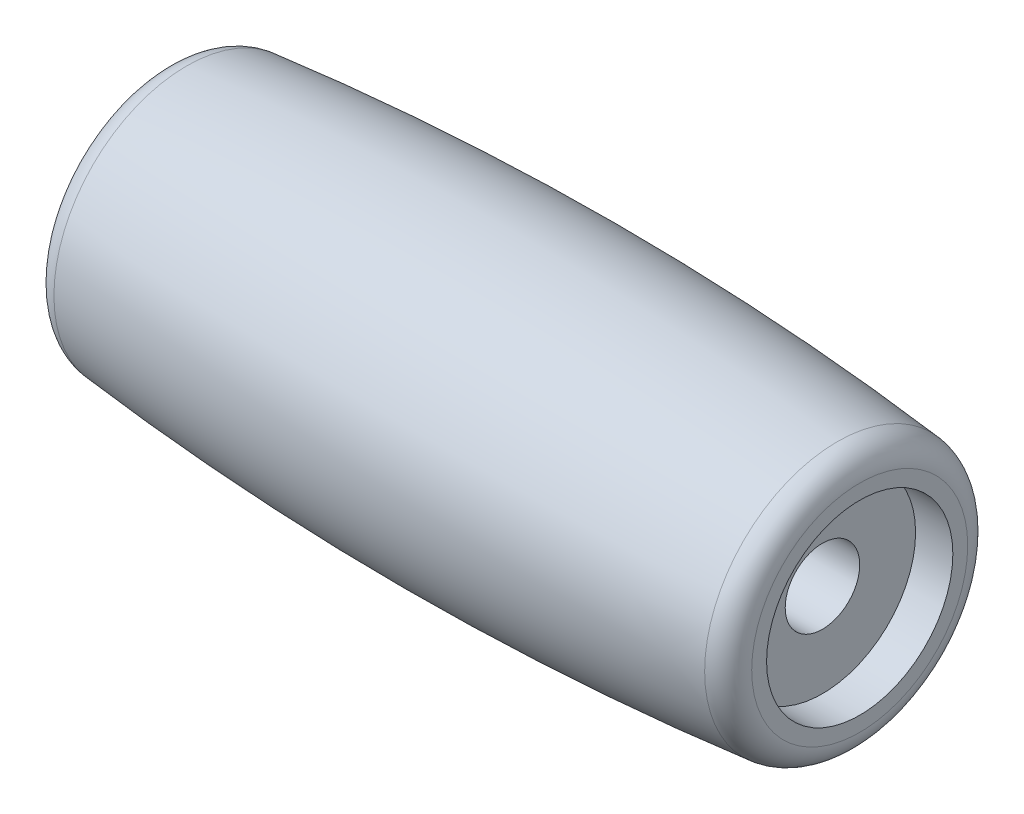
ISO-10303-21;
HEADER;
FILE_DESCRIPTION(('STEP AP214'),'2;1');
FILE_NAME('part.step','',(''),(''),'','','');
FILE_SCHEMA(('AUTOMOTIVE_DESIGN { 1 0 10303 214 1 1 1 1 }'));
ENDSEC;
DATA;
#1=APPLICATION_CONTEXT('core data for automotive mechanical design processes');
#2=APPLICATION_PROTOCOL_DEFINITION('international standard','automotive_design',2000,#1);
#3=PRODUCT_CONTEXT('',#1,'mechanical');
#4=PRODUCT('Part','Part','',(#3));
#5=PRODUCT_RELATED_PRODUCT_CATEGORY('part','',(#4));
#6=PRODUCT_DEFINITION_FORMATION('','',#4);
#7=PRODUCT_DEFINITION_CONTEXT('part definition',#1,'design');
#8=PRODUCT_DEFINITION('design','',#6,#7);
#9=PRODUCT_DEFINITION_SHAPE('','',#8);
#10=(LENGTH_UNIT() NAMED_UNIT(*) SI_UNIT(.MILLI.,.METRE.));
#11=(NAMED_UNIT(*) PLANE_ANGLE_UNIT() SI_UNIT($,.RADIAN.));
#12=(NAMED_UNIT(*) SI_UNIT($,.STERADIAN.) SOLID_ANGLE_UNIT());
#13=UNCERTAINTY_MEASURE_WITH_UNIT(LENGTH_MEASURE(1.E-05),#10,'distance_accuracy_value','');
#14=(GEOMETRIC_REPRESENTATION_CONTEXT(3) GLOBAL_UNCERTAINTY_ASSIGNED_CONTEXT((#13)) GLOBAL_UNIT_ASSIGNED_CONTEXT((#10,
#11,#12)) REPRESENTATION_CONTEXT('',''));
#15=CARTESIAN_POINT('',(0.,0.,0.));
#16=DIRECTION('',(0.,0.,1.));
#17=DIRECTION('',(1.,0.,0.));
#18=AXIS2_PLACEMENT_3D('',#15,#16,#17);
#19=CARTESIAN_POINT('',(12.5,1.5,0.));
#20=DIRECTION('',(-1.,0.,0.));
#21=DIRECTION('',(0.,0.,1.));
#22=AXIS2_PLACEMENT_3D('',#19,#20,#21);
#23=PLANE('',#22);
#24=CARTESIAN_POINT('',(12.5,0.,0.));
#25=DIRECTION('',(-1.,0.,0.));
#26=DIRECTION('',(0.,0.,1.));
#27=AXIS2_PLACEMENT_3D('',#24,#25,#26);
#28=CIRCLE('',#27,3.75);
#29=CARTESIAN_POINT('',(12.5,0.,3.75));
#30=VERTEX_POINT('',#29);
#31=EDGE_CURVE('E10',#30,#30,#28,.T.);
#32=ORIENTED_EDGE('',*,*,#31,.F.);
#33=EDGE_LOOP('',(#32));
#34=FACE_BOUND('',#33,.T.);
#35=CARTESIAN_POINT('',(12.5,0.,0.));
#36=DIRECTION('',(-1.,0.,0.));
#37=DIRECTION('',(0.,0.,1.));
#38=AXIS2_PLACEMENT_3D('',#35,#36,#37);
#39=CIRCLE('',#38,1.5);
#40=CARTESIAN_POINT('',(12.5,0.,1.5));
#41=VERTEX_POINT('',#40);
#42=EDGE_CURVE('E68',#41,#41,#39,.T.);
#43=ORIENTED_EDGE('',*,*,#42,.T.);
#44=EDGE_LOOP('',(#43));
#45=FACE_BOUND('',#44,.T.);
#46=ADVANCED_FACE('F34',(#34,#45),#23,.F.);
#47=CARTESIAN_POINT('',(0.,0.,0.));
#48=DIRECTION('',(-1.,0.,0.));
#49=DIRECTION('',(0.,0.,1.));
#50=AXIS2_PLACEMENT_3D('',#47,#48,#49);
#51=CYLINDRICAL_SURFACE('',#50,3.75);
#52=CARTESIAN_POINT('',(14.,0.,0.));
#53=DIRECTION('',(-1.,0.,0.));
#54=DIRECTION('',(0.,0.,1.));
#55=AXIS2_PLACEMENT_3D('',#52,#53,#54);
#56=CIRCLE('',#55,3.75);
#57=CARTESIAN_POINT('',(14.,0.,3.75));
#58=VERTEX_POINT('',#57);
#59=EDGE_CURVE('E40',#58,#58,#56,.T.);
#60=ORIENTED_EDGE('',*,*,#59,.F.);
#61=EDGE_LOOP('',(#60));
#62=FACE_BOUND('',#61,.T.);
#63=ORIENTED_EDGE('',*,*,#31,.T.);
#64=EDGE_LOOP('',(#63));
#65=FACE_BOUND('',#64,.T.);
#66=ADVANCED_FACE('F117',(#62,#65),#51,.F.);
#67=CARTESIAN_POINT('',(14.,3.75,0.));
#68=DIRECTION('',(-1.,0.,0.));
#69=DIRECTION('',(0.,0.,1.));
#70=AXIS2_PLACEMENT_3D('',#67,#68,#69);
#71=PLANE('',#70);
#72=CARTESIAN_POINT('',(14.,0.,0.));
#73=DIRECTION('',(-1.,0.,0.));
#74=DIRECTION('',(0.,0.,1.));
#75=AXIS2_PLACEMENT_3D('',#72,#73,#74);
#76=CIRCLE('',#75,4.34857666506391);
#77=CARTESIAN_POINT('',(14.,0.,4.34857666506391));
#78=VERTEX_POINT('',#77);
#79=EDGE_CURVE('E44',#78,#78,#76,.T.);
#80=ORIENTED_EDGE('',*,*,#79,.F.);
#81=EDGE_LOOP('',(#80));
#82=FACE_BOUND('',#81,.T.);
#83=ORIENTED_EDGE('',*,*,#59,.T.);
#84=EDGE_LOOP('',(#83));
#85=FACE_BOUND('',#84,.T.);
#86=ADVANCED_FACE('F112',(#82,#85),#71,.F.);
#87=CARTESIAN_POINT('',(13.,0.,0.));
#88=DIRECTION('',(-1.,0.,0.));
#89=DIRECTION('',(0.,0.,1.));
#90=AXIS2_PLACEMENT_3D('',#87,#88,#89);
#91=TOROIDAL_SURFACE('',#90,4.34857666506391,0.999999999999987);
#92=CARTESIAN_POINT('',(13.0999679589875,0.,0.));
#93=DIRECTION('',(-1.,0.,0.));
#94=DIRECTION('',(0.,0.,1.));
#95=AXIS2_PLACEMENT_3D('',#92,#93,#94);
#96=CIRCLE('',#95,5.34356732189231);
#97=CARTESIAN_POINT('',(13.0999679589875,0.,5.34356732189231));
#98=VERTEX_POINT('',#97);
#99=EDGE_CURVE('E48',#98,#98,#96,.T.);
#100=ORIENTED_EDGE('',*,*,#99,.F.);
#101=EDGE_LOOP('',(#100));
#102=FACE_BOUND('',#101,.T.);
#103=ORIENTED_EDGE('',*,*,#79,.T.);
#104=EDGE_LOOP('',(#103));
#105=FACE_BOUND('',#104,.T.);
#106=ADVANCED_FACE('F106',(#102,#105),#91,.T.);
#107=CARTESIAN_POINT('',(0.,0.,0.));
#108=DIRECTION('',(-1.,0.,0.));
#109=DIRECTION('',(0.,0.,1.));
#110=AXIS2_PLACEMENT_3D('',#107,#108,#109);
#111=DEGENERATE_TOROIDAL_SURFACE('',#110,125.041666666666,131.041666666666,.F.);
#112=CARTESIAN_POINT('',(-13.0999679589875,0.,0.));
#113=DIRECTION('',(-1.,0.,0.));
#114=DIRECTION('',(0.,0.,1.));
#115=AXIS2_PLACEMENT_3D('',#112,#113,#114);
#116=CIRCLE('',#115,5.34356732189233);
#117=CARTESIAN_POINT('',(-13.0999679589875,0.,5.34356732189233));
#118=VERTEX_POINT('',#117);
#119=EDGE_CURVE('E53',#118,#118,#116,.T.);
#120=ORIENTED_EDGE('',*,*,#119,.F.);
#121=EDGE_LOOP('',(#120));
#122=FACE_BOUND('',#121,.T.);
#123=ORIENTED_EDGE('',*,*,#99,.T.);
#124=EDGE_LOOP('',(#123));
#125=FACE_BOUND('',#124,.T.);
#126=ADVANCED_FACE('F100',(#122,#125),#111,.F.);
#127=CARTESIAN_POINT('',(-13.,0.,0.));
#128=DIRECTION('',(-1.,0.,0.));
#129=DIRECTION('',(0.,0.,1.));
#130=AXIS2_PLACEMENT_3D('',#127,#128,#129);
#131=TOROIDAL_SURFACE('',#130,4.34857666506391,0.999999999999987);
#132=CARTESIAN_POINT('',(-14.,0.,0.));
#133=DIRECTION('',(-1.,0.,0.));
#134=DIRECTION('',(0.,0.,1.));
#135=AXIS2_PLACEMENT_3D('',#132,#133,#134);
#136=CIRCLE('',#135,4.34857666506391);
#137=CARTESIAN_POINT('',(-14.,0.,4.34857666506391));
#138=VERTEX_POINT('',#137);
#139=EDGE_CURVE('E56',#138,#138,#136,.T.);
#140=ORIENTED_EDGE('',*,*,#139,.F.);
#141=EDGE_LOOP('',(#140));
#142=FACE_BOUND('',#141,.T.);
#143=ORIENTED_EDGE('',*,*,#119,.T.);
#144=EDGE_LOOP('',(#143));
#145=FACE_BOUND('',#144,.T.);
#146=ADVANCED_FACE('F94',(#142,#145),#131,.T.);
#147=CARTESIAN_POINT('',(-14.,3.75,0.));
#148=DIRECTION('',(1.,0.,0.));
#149=DIRECTION('',(0.,0.,-1.));
#150=AXIS2_PLACEMENT_3D('',#147,#148,#149);
#151=PLANE('',#150);
#152=CARTESIAN_POINT('',(-14.,0.,0.));
#153=DIRECTION('',(-1.,0.,0.));
#154=DIRECTION('',(0.,0.,1.));
#155=AXIS2_PLACEMENT_3D('',#152,#153,#154);
#156=CIRCLE('',#155,3.75);
#157=CARTESIAN_POINT('',(-14.,0.,3.75));
#158=VERTEX_POINT('',#157);
#159=EDGE_CURVE('E59',#158,#158,#156,.T.);
#160=ORIENTED_EDGE('',*,*,#159,.F.);
#161=EDGE_LOOP('',(#160));
#162=FACE_BOUND('',#161,.T.);
#163=ORIENTED_EDGE('',*,*,#139,.T.);
#164=EDGE_LOOP('',(#163));
#165=FACE_BOUND('',#164,.T.);
#166=ADVANCED_FACE('F88',(#162,#165),#151,.F.);
#167=CARTESIAN_POINT('',(0.,0.,0.));
#168=DIRECTION('',(-1.,0.,0.));
#169=DIRECTION('',(0.,0.,1.));
#170=AXIS2_PLACEMENT_3D('',#167,#168,#169);
#171=CYLINDRICAL_SURFACE('',#170,3.75);
#172=CARTESIAN_POINT('',(-12.5,0.,0.));
#173=DIRECTION('',(-1.,0.,0.));
#174=DIRECTION('',(0.,0.,1.));
#175=AXIS2_PLACEMENT_3D('',#172,#173,#174);
#176=CIRCLE('',#175,3.75);
#177=CARTESIAN_POINT('',(-12.5,0.,3.75));
#178=VERTEX_POINT('',#177);
#179=EDGE_CURVE('E62',#178,#178,#176,.T.);
#180=ORIENTED_EDGE('',*,*,#179,.F.);
#181=EDGE_LOOP('',(#180));
#182=FACE_BOUND('',#181,.T.);
#183=ORIENTED_EDGE('',*,*,#159,.T.);
#184=EDGE_LOOP('',(#183));
#185=FACE_BOUND('',#184,.T.);
#186=ADVANCED_FACE('F82',(#182,#185),#171,.F.);
#187=CARTESIAN_POINT('',(-12.5,1.5,0.));
#188=DIRECTION('',(1.,0.,0.));
#189=DIRECTION('',(0.,0.,-1.));
#190=AXIS2_PLACEMENT_3D('',#187,#188,#189);
#191=PLANE('',#190);
#192=CARTESIAN_POINT('',(-12.5,0.,0.));
#193=DIRECTION('',(-1.,0.,0.));
#194=DIRECTION('',(0.,0.,1.));
#195=AXIS2_PLACEMENT_3D('',#192,#193,#194);
#196=CIRCLE('',#195,1.5);
#197=CARTESIAN_POINT('',(-12.5,0.,1.5));
#198=VERTEX_POINT('',#197);
#199=EDGE_CURVE('E65',#198,#198,#196,.T.);
#200=ORIENTED_EDGE('',*,*,#199,.F.);
#201=EDGE_LOOP('',(#200));
#202=FACE_BOUND('',#201,.T.);
#203=ORIENTED_EDGE('',*,*,#179,.T.);
#204=EDGE_LOOP('',(#203));
#205=FACE_BOUND('',#204,.T.);
#206=ADVANCED_FACE('F76',(#202,#205),#191,.F.);
#207=CARTESIAN_POINT('',(0.,0.,0.));
#208=DIRECTION('',(-1.,0.,0.));
#209=DIRECTION('',(0.,0.,1.));
#210=AXIS2_PLACEMENT_3D('',#207,#208,#209);
#211=CYLINDRICAL_SURFACE('',#210,1.5);
#212=ORIENTED_EDGE('',*,*,#42,.F.);
#213=EDGE_LOOP('',(#212));
#214=FACE_BOUND('',#213,.T.);
#215=ORIENTED_EDGE('',*,*,#199,.T.);
#216=EDGE_LOOP('',(#215));
#217=FACE_BOUND('',#216,.T.);
#218=ADVANCED_FACE('F73',(#214,#217),#211,.F.);
#219=CLOSED_SHELL('',(#46,#66,#86,#106,#126,#146,#166,#186,#206,#218));
#220=MANIFOLD_SOLID_BREP('B2',#219);
#221=ADVANCED_BREP_SHAPE_REPRESENTATION('',(#18,#220),#14);
#222=SHAPE_DEFINITION_REPRESENTATION(#9,#221);
ENDSEC;
END-ISO-10303-21;
